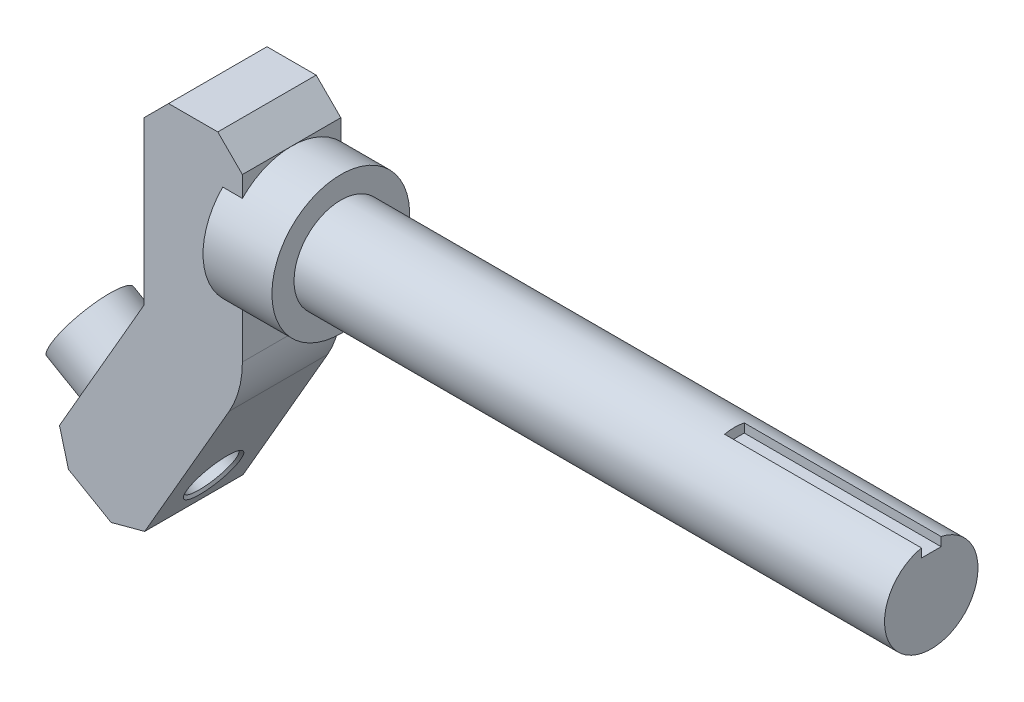
ISO-10303-21;
HEADER;
FILE_DESCRIPTION(('STEP AP214'),'2;1');
FILE_NAME('part.step','',(''),(''),'','','');
FILE_SCHEMA(('AUTOMOTIVE_DESIGN { 1 0 10303 214 1 1 1 1 }'));
ENDSEC;
DATA;
#1=APPLICATION_CONTEXT('core data for automotive mechanical design processes');
#2=APPLICATION_PROTOCOL_DEFINITION('international standard','automotive_design',2000,#1);
#3=PRODUCT_CONTEXT('',#1,'mechanical');
#4=PRODUCT('Part','Part','',(#3));
#5=PRODUCT_RELATED_PRODUCT_CATEGORY('part','',(#4));
#6=PRODUCT_DEFINITION_FORMATION('','',#4);
#7=PRODUCT_DEFINITION_CONTEXT('part definition',#1,'design');
#8=PRODUCT_DEFINITION('design','',#6,#7);
#9=PRODUCT_DEFINITION_SHAPE('','',#8);
#10=(LENGTH_UNIT() NAMED_UNIT(*) SI_UNIT(.MILLI.,.METRE.));
#11=(NAMED_UNIT(*) PLANE_ANGLE_UNIT() SI_UNIT($,.RADIAN.));
#12=(NAMED_UNIT(*) SI_UNIT($,.STERADIAN.) SOLID_ANGLE_UNIT());
#13=UNCERTAINTY_MEASURE_WITH_UNIT(LENGTH_MEASURE(1.E-05),#10,'distance_accuracy_value','');
#14=(GEOMETRIC_REPRESENTATION_CONTEXT(3) GLOBAL_UNCERTAINTY_ASSIGNED_CONTEXT((#13)) GLOBAL_UNIT_ASSIGNED_CONTEXT((#10,
#11,#12)) REPRESENTATION_CONTEXT('',''));
#15=CARTESIAN_POINT('',(0.,0.,0.));
#16=DIRECTION('',(0.,0.,1.));
#17=DIRECTION('',(1.,0.,0.));
#18=AXIS2_PLACEMENT_3D('',#15,#16,#17);
#19=CARTESIAN_POINT('',(-30.,-19.,10.));
#20=DIRECTION('',(0.866025403784438,-0.500000000000001,0.));
#21=DIRECTION('',(0.500000000000001,0.866025403784438,0.));
#22=AXIS2_PLACEMENT_3D('',#19,#20,#21);
#23=PLANE('',#22);
#24=DIRECTION('',(0.,0.,1.));
#25=VECTOR('',#24,1.);
#26=CARTESIAN_POINT('',(-47.1727586640479,-48.7440905122495,10.));
#27=LINE('',#26,#25);
#28=CARTESIAN_POINT('',(-47.1727586640479,-48.7440905122495,-10.));
#29=VERTEX_POINT('',#28);
#30=CARTESIAN_POINT('',(-47.1727586640479,-48.7440905122495,0.));
#31=VERTEX_POINT('',#30);
#32=EDGE_CURVE('E206',#29,#31,#27,.T.);
#33=ORIENTED_EDGE('',*,*,#32,.T.);
#34=CARTESIAN_POINT('',(-43.1727586640478,-41.815887281974,0.));
#35=DIRECTION('',(-0.866025403784438,0.500000000000001,0.));
#36=DIRECTION('',(-0.500000000000001,-0.866025403784438,0.));
#37=AXIS2_PLACEMENT_3D('',#34,#35,#36);
#38=CIRCLE('',#37,8.);
#39=EDGE_CURVE('E208',#31,#31,#38,.T.);
#40=ORIENTED_EDGE('',*,*,#39,.F.);
#41=CARTESIAN_POINT('',(-47.1727586640479,-48.7440905122495,10.));
#42=VERTEX_POINT('',#41);
#43=EDGE_CURVE('E66',#31,#42,#27,.T.);
#44=ORIENTED_EDGE('',*,*,#43,.T.);
#45=DIRECTION('',(-0.500000000000001,-0.866025403784438,0.));
#46=VECTOR('',#45,1.);
#47=CARTESIAN_POINT('',(-30.,-19.,10.));
#48=LINE('',#47,#46);
#49=CARTESIAN_POINT('',(-30.,-19.,10.));
#50=VERTEX_POINT('',#49);
#51=EDGE_CURVE('E607',#50,#42,#48,.T.);
#52=ORIENTED_EDGE('',*,*,#51,.F.);
#53=DIRECTION('',(0.,0.,-1.));
#54=VECTOR('',#53,1.);
#55=CARTESIAN_POINT('',(-30.,-19.,10.));
#56=LINE('',#55,#54);
#57=CARTESIAN_POINT('',(-30.,-19.,-10.));
#58=VERTEX_POINT('',#57);
#59=EDGE_CURVE('E554',#50,#58,#56,.T.);
#60=ORIENTED_EDGE('',*,*,#59,.T.);
#61=DIRECTION('',(-0.500000000000001,-0.866025403784438,0.));
#62=VECTOR('',#61,1.);
#63=CARTESIAN_POINT('',(-30.,-19.,-10.));
#64=LINE('',#63,#62);
#65=EDGE_CURVE('E211',#58,#29,#64,.T.);
#66=ORIENTED_EDGE('',*,*,#65,.T.);
#67=EDGE_LOOP('',(#33,#40,#44,#52,#60,#66));
#68=FACE_BOUND('',#67,.T.);
#69=ADVANCED_FACE('F41',(#68),#23,.F.);
#70=CARTESIAN_POINT('',(-10.,19.,10.));
#71=DIRECTION('',(-1.,0.,0.));
#72=DIRECTION('',(0.,-1.,0.));
#73=AXIS2_PLACEMENT_3D('',#70,#71,#72);
#74=PLANE('',#73);
#75=DIRECTION('',(0.,1.,0.));
#76=VECTOR('',#75,1.);
#77=CARTESIAN_POINT('',(-10.,19.,-10.));
#78=LINE('',#77,#76);
#79=CARTESIAN_POINT('',(-9.99999999999999,9.79795897113271,-10.));
#80=VERTEX_POINT('',#79);
#81=CARTESIAN_POINT('',(-10.,14.,-10.));
#82=VERTEX_POINT('',#81);
#83=EDGE_CURVE('E591',#80,#82,#78,.T.);
#84=ORIENTED_EDGE('',*,*,#83,.T.);
#85=DIRECTION('',(0.,0.,1.));
#86=VECTOR('',#85,1.);
#87=CARTESIAN_POINT('',(-10.,14.,10.));
#88=LINE('',#87,#86);
#89=CARTESIAN_POINT('',(-10.,14.,0.));
#90=VERTEX_POINT('',#89);
#91=EDGE_CURVE('E434',#82,#90,#88,.T.);
#92=ORIENTED_EDGE('',*,*,#91,.T.);
#93=CARTESIAN_POINT('',(-9.99999999999999,0.,0.));
#94=DIRECTION('',(-1.,0.,0.));
#95=DIRECTION('',(0.,-1.,0.));
#96=AXIS2_PLACEMENT_3D('',#93,#94,#95);
#97=CIRCLE('',#96,14.);
#98=EDGE_CURVE('E467',#90,#80,#97,.T.);
#99=ORIENTED_EDGE('',*,*,#98,.T.);
#100=EDGE_LOOP('',(#84,#92,#99));
#101=FACE_BOUND('',#100,.T.);
#102=ADVANCED_FACE('F259',(#101),#74,.F.);
#103=CARTESIAN_POINT('',(-14.,0.,0.));
#104=DIRECTION('',(1.,0.,0.));
#105=DIRECTION('',(0.,0.,-1.));
#106=AXIS2_PLACEMENT_3D('',#103,#104,#105);
#107=CYLINDRICAL_SURFACE('',#106,14.);
#108=CARTESIAN_POINT('',(0.,0.,0.));
#109=DIRECTION('',(-1.,0.,0.));
#110=DIRECTION('',(0.,0.,1.));
#111=AXIS2_PLACEMENT_3D('',#108,#109,#110);
#112=CIRCLE('',#111,14.);
#113=CARTESIAN_POINT('',(0.,0.,14.));
#114=VERTEX_POINT('',#113);
#115=EDGE_CURVE('E530',#114,#114,#112,.T.);
#116=ORIENTED_EDGE('',*,*,#115,.T.);
#117=EDGE_LOOP('',(#116));
#118=FACE_BOUND('',#117,.T.);
#119=DIRECTION('',(1.,0.,0.));
#120=VECTOR('',#119,1.);
#121=CARTESIAN_POINT('',(-14.,9.79795897113271,10.));
#122=LINE('',#121,#120);
#123=CARTESIAN_POINT('',(-14.,9.79795897113271,10.));
#124=VERTEX_POINT('',#123);
#125=CARTESIAN_POINT('',(-10.,9.79795897113271,10.));
#126=VERTEX_POINT('',#125);
#127=EDGE_CURVE('E535',#124,#126,#122,.T.);
#128=ORIENTED_EDGE('',*,*,#127,.F.);
#129=CARTESIAN_POINT('',(-14.,0.,0.));
#130=DIRECTION('',(-1.,0.,0.));
#131=DIRECTION('',(0.,0.,1.));
#132=AXIS2_PLACEMENT_3D('',#129,#130,#131);
#133=CIRCLE('',#132,14.);
#134=CARTESIAN_POINT('',(-14.,-9.79795897113271,10.));
#135=VERTEX_POINT('',#134);
#136=EDGE_CURVE('E534',#135,#124,#133,.T.);
#137=ORIENTED_EDGE('',*,*,#136,.F.);
#138=DIRECTION('',(1.,0.,0.));
#139=VECTOR('',#138,1.);
#140=CARTESIAN_POINT('',(-14.,-9.79795897113271,10.));
#141=LINE('',#140,#139);
#142=CARTESIAN_POINT('',(-9.99999999999999,-9.79795897113271,10.));
#143=VERTEX_POINT('',#142);
#144=EDGE_CURVE('E542',#143,#135,#141,.F.);
#145=ORIENTED_EDGE('',*,*,#144,.F.);
#146=CARTESIAN_POINT('',(-10.,0.,0.));
#147=DIRECTION('',(-1.,0.,0.));
#148=DIRECTION('',(0.,-1.,0.));
#149=AXIS2_PLACEMENT_3D('',#146,#147,#148);
#150=CIRCLE('',#149,14.);
#151=CARTESIAN_POINT('',(-9.99999999999999,-9.79795897113271,-10.));
#152=VERTEX_POINT('',#151);
#153=EDGE_CURVE('E468',#152,#143,#150,.T.);
#154=ORIENTED_EDGE('',*,*,#153,.F.);
#155=DIRECTION('',(1.,0.,0.));
#156=VECTOR('',#155,1.);
#157=CARTESIAN_POINT('',(-14.,-9.79795897113271,-10.));
#158=LINE('',#157,#156);
#159=CARTESIAN_POINT('',(-14.,-9.79795897113271,-10.));
#160=VERTEX_POINT('',#159);
#161=EDGE_CURVE('E550',#152,#160,#158,.F.);
#162=ORIENTED_EDGE('',*,*,#161,.T.);
#163=CARTESIAN_POINT('',(-14.,9.79795897113271,-10.));
#164=VERTEX_POINT('',#163);
#165=EDGE_CURVE('E487',#164,#160,#133,.T.);
#166=ORIENTED_EDGE('',*,*,#165,.F.);
#167=DIRECTION('',(1.,0.,0.));
#168=VECTOR('',#167,1.);
#169=CARTESIAN_POINT('',(-14.,9.79795897113271,-10.));
#170=LINE('',#169,#168);
#171=EDGE_CURVE('E546',#164,#80,#170,.T.);
#172=ORIENTED_EDGE('',*,*,#171,.T.);
#173=ORIENTED_EDGE('',*,*,#98,.F.);
#174=EDGE_CURVE('E463',#126,#90,#97,.T.);
#175=ORIENTED_EDGE('',*,*,#174,.F.);
#176=EDGE_LOOP('',(#128,#137,#145,#154,#162,#166,#172,#173,#175));
#177=FACE_BOUND('',#176,.T.);
#178=ADVANCED_FACE('F264',(#118,#177),#107,.T.);
#179=CARTESIAN_POINT('',(-14.,0.,0.));
#180=DIRECTION('',(-1.,0.,0.));
#181=DIRECTION('',(0.,0.,1.));
#182=AXIS2_PLACEMENT_3D('',#179,#180,#181);
#183=PLANE('',#182);
#184=DIRECTION('',(0.,-1.,0.));
#185=VECTOR('',#184,1.);
#186=CARTESIAN_POINT('',(-14.,0.,-10.));
#187=LINE('',#186,#185);
#188=CARTESIAN_POINT('',(-14.,-8.49999999999997,-10.));
#189=VERTEX_POINT('',#188);
#190=EDGE_CURVE('E477',#189,#160,#187,.T.);
#191=ORIENTED_EDGE('',*,*,#190,.F.);
#192=DIRECTION('',(0.,0.,-1.));
#193=VECTOR('',#192,1.);
#194=CARTESIAN_POINT('',(-14.,-8.49999999999997,0.));
#195=LINE('',#194,#193);
#196=CARTESIAN_POINT('',(-14.,-8.49999999999997,10.));
#197=VERTEX_POINT('',#196);
#198=EDGE_CURVE('E418',#189,#197,#195,.F.);
#199=ORIENTED_EDGE('',*,*,#198,.T.);
#200=DIRECTION('',(0.,-1.,0.));
#201=VECTOR('',#200,1.);
#202=CARTESIAN_POINT('',(-14.,0.,10.));
#203=LINE('',#202,#201);
#204=EDGE_CURVE('E473',#197,#135,#203,.T.);
#205=ORIENTED_EDGE('',*,*,#204,.T.);
#206=ORIENTED_EDGE('',*,*,#136,.T.);
#207=CARTESIAN_POINT('',(-14.,8.49999999999998,10.));
#208=VERTEX_POINT('',#207);
#209=EDGE_CURVE('E472',#124,#208,#203,.T.);
#210=ORIENTED_EDGE('',*,*,#209,.T.);
#211=DIRECTION('',(0.,0.,1.));
#212=VECTOR('',#211,1.);
#213=CARTESIAN_POINT('',(-14.,8.49999999999998,0.));
#214=LINE('',#213,#212);
#215=CARTESIAN_POINT('',(-14.,8.49999999999998,-10.));
#216=VERTEX_POINT('',#215);
#217=EDGE_CURVE('E422',#208,#216,#214,.F.);
#218=ORIENTED_EDGE('',*,*,#217,.T.);
#219=EDGE_CURVE('E476',#164,#216,#187,.T.);
#220=ORIENTED_EDGE('',*,*,#219,.F.);
#221=ORIENTED_EDGE('',*,*,#165,.T.);
#222=EDGE_LOOP('',(#191,#199,#205,#206,#210,#218,#220,#221));
#223=FACE_BOUND('',#222,.T.);
#224=ADVANCED_FACE('F283',(#223),#183,.T.);
#225=CARTESIAN_POINT('',(120.,0.,0.));
#226=DIRECTION('',(-1.,0.,0.));
#227=DIRECTION('',(0.,0.,1.));
#228=AXIS2_PLACEMENT_3D('',#225,#226,#227);
#229=CYLINDRICAL_SURFACE('',#228,9.5);
#230=CARTESIAN_POINT('',(80.,0.,0.));
#231=DIRECTION('',(1.,0.,0.));
#232=DIRECTION('',(0.,0.,-1.));
#233=AXIS2_PLACEMENT_3D('',#230,#231,#232);
#234=CIRCLE('',#233,9.5);
#235=CARTESIAN_POINT('',(80.,9.28708781050335,-2.));
#236=VERTEX_POINT('',#235);
#237=CARTESIAN_POINT('',(80.,9.28708781050335,2.));
#238=VERTEX_POINT('',#237);
#239=EDGE_CURVE('E508',#236,#238,#234,.T.);
#240=ORIENTED_EDGE('',*,*,#239,.F.);
#241=DIRECTION('',(1.,0.,0.));
#242=VECTOR('',#241,1.);
#243=CARTESIAN_POINT('',(80.,9.28708781050335,-2.));
#244=LINE('',#243,#242);
#245=CARTESIAN_POINT('',(120.,9.28708781050335,-2.));
#246=VERTEX_POINT('',#245);
#247=EDGE_CURVE('E491',#236,#246,#244,.T.);
#248=ORIENTED_EDGE('',*,*,#247,.T.);
#249=CARTESIAN_POINT('',(120.,0.,0.));
#250=DIRECTION('',(1.,0.,0.));
#251=DIRECTION('',(0.,0.,-1.));
#252=AXIS2_PLACEMENT_3D('',#249,#250,#251);
#253=CIRCLE('',#252,9.5);
#254=CARTESIAN_POINT('',(120.,9.28708781050335,2.));
#255=VERTEX_POINT('',#254);
#256=EDGE_CURVE('E481',#255,#246,#253,.T.);
#257=ORIENTED_EDGE('',*,*,#256,.F.);
#258=DIRECTION('',(1.,0.,0.));
#259=VECTOR('',#258,1.);
#260=CARTESIAN_POINT('',(80.,9.28708781050335,2.));
#261=LINE('',#260,#259);
#262=EDGE_CURVE('E492',#238,#255,#261,.T.);
#263=ORIENTED_EDGE('',*,*,#262,.F.);
#264=EDGE_LOOP('',(#240,#248,#257,#263));
#265=FACE_BOUND('',#264,.T.);
#266=CARTESIAN_POINT('',(0.,0.,0.));
#267=DIRECTION('',(1.,0.,0.));
#268=DIRECTION('',(0.,0.,-1.));
#269=AXIS2_PLACEMENT_3D('',#266,#267,#268);
#270=CIRCLE('',#269,9.5);
#271=CARTESIAN_POINT('',(0.,0.,-9.5));
#272=VERTEX_POINT('',#271);
#273=EDGE_CURVE('E482',#272,#272,#270,.T.);
#274=ORIENTED_EDGE('',*,*,#273,.T.);
#275=EDGE_LOOP('',(#274));
#276=FACE_BOUND('',#275,.T.);
#277=ADVANCED_FACE('F286',(#265,#276),#229,.T.);
#278=CARTESIAN_POINT('',(120.,0.,0.));
#279=DIRECTION('',(1.,0.,0.));
#280=DIRECTION('',(0.,0.,-1.));
#281=AXIS2_PLACEMENT_3D('',#278,#279,#280);
#282=PLANE('',#281);
#283=DIRECTION('',(0.,1.,0.));
#284=VECTOR('',#283,1.);
#285=CARTESIAN_POINT('',(120.,7.5,-2.));
#286=LINE('',#285,#284);
#287=CARTESIAN_POINT('',(120.,7.5,-2.));
#288=VERTEX_POINT('',#287);
#289=EDGE_CURVE('E505',#288,#246,#286,.T.);
#290=ORIENTED_EDGE('',*,*,#289,.F.);
#291=DIRECTION('',(0.,0.,-1.));
#292=VECTOR('',#291,1.);
#293=CARTESIAN_POINT('',(120.,7.5,2.));
#294=LINE('',#293,#292);
#295=CARTESIAN_POINT('',(120.,7.5,2.));
#296=VERTEX_POINT('',#295);
#297=EDGE_CURVE('E509',#296,#288,#294,.T.);
#298=ORIENTED_EDGE('',*,*,#297,.F.);
#299=DIRECTION('',(0.,-1.,0.));
#300=VECTOR('',#299,1.);
#301=CARTESIAN_POINT('',(120.,9.28708781050335,2.));
#302=LINE('',#301,#300);
#303=EDGE_CURVE('E486',#255,#296,#302,.T.);
#304=ORIENTED_EDGE('',*,*,#303,.F.);
#305=ORIENTED_EDGE('',*,*,#256,.T.);
#306=EDGE_LOOP('',(#290,#298,#304,#305));
#307=FACE_BOUND('',#306,.T.);
#308=ADVANCED_FACE('F305',(#307),#282,.T.);
#309=CARTESIAN_POINT('',(80.,7.5,-2.));
#310=DIRECTION('',(0.,0.,-1.));
#311=DIRECTION('',(-1.,0.,0.));
#312=AXIS2_PLACEMENT_3D('',#309,#310,#311);
#313=PLANE('',#312);
#314=ORIENTED_EDGE('',*,*,#289,.T.);
#315=ORIENTED_EDGE('',*,*,#247,.F.);
#316=DIRECTION('',(0.,1.,0.));
#317=VECTOR('',#316,1.);
#318=CARTESIAN_POINT('',(80.,7.5,-2.));
#319=LINE('',#318,#317);
#320=CARTESIAN_POINT('',(80.,7.5,-2.));
#321=VERTEX_POINT('',#320);
#322=EDGE_CURVE('E496',#321,#236,#319,.T.);
#323=ORIENTED_EDGE('',*,*,#322,.F.);
#324=DIRECTION('',(1.,0.,0.));
#325=VECTOR('',#324,1.);
#326=CARTESIAN_POINT('',(80.,7.5,-2.));
#327=LINE('',#326,#325);
#328=EDGE_CURVE('E499',#321,#288,#327,.T.);
#329=ORIENTED_EDGE('',*,*,#328,.T.);
#330=EDGE_LOOP('',(#314,#315,#323,#329));
#331=FACE_BOUND('',#330,.T.);
#332=ADVANCED_FACE('F301',(#331),#313,.F.);
#333=CARTESIAN_POINT('',(80.,7.5,2.));
#334=DIRECTION('',(0.,-1.,0.));
#335=DIRECTION('',(0.,0.,-1.));
#336=AXIS2_PLACEMENT_3D('',#333,#334,#335);
#337=PLANE('',#336);
#338=ORIENTED_EDGE('',*,*,#297,.T.);
#339=ORIENTED_EDGE('',*,*,#328,.F.);
#340=DIRECTION('',(0.,0.,-1.));
#341=VECTOR('',#340,1.);
#342=CARTESIAN_POINT('',(80.,7.5,2.));
#343=LINE('',#342,#341);
#344=CARTESIAN_POINT('',(80.,7.5,2.));
#345=VERTEX_POINT('',#344);
#346=EDGE_CURVE('E519',#345,#321,#343,.T.);
#347=ORIENTED_EDGE('',*,*,#346,.F.);
#348=DIRECTION('',(1.,0.,0.));
#349=VECTOR('',#348,1.);
#350=CARTESIAN_POINT('',(80.,7.5,2.));
#351=LINE('',#350,#349);
#352=EDGE_CURVE('E495',#345,#296,#351,.T.);
#353=ORIENTED_EDGE('',*,*,#352,.T.);
#354=EDGE_LOOP('',(#338,#339,#347,#353));
#355=FACE_BOUND('',#354,.T.);
#356=ADVANCED_FACE('F304',(#355),#337,.F.);
#357=CARTESIAN_POINT('',(80.,9.28708781050335,2.));
#358=DIRECTION('',(0.,0.,1.));
#359=DIRECTION('',(1.,0.,0.));
#360=AXIS2_PLACEMENT_3D('',#357,#358,#359);
#361=PLANE('',#360);
#362=ORIENTED_EDGE('',*,*,#303,.T.);
#363=ORIENTED_EDGE('',*,*,#352,.F.);
#364=DIRECTION('',(0.,-1.,0.));
#365=VECTOR('',#364,1.);
#366=CARTESIAN_POINT('',(80.,9.28708781050335,2.));
#367=LINE('',#366,#365);
#368=EDGE_CURVE('E523',#238,#345,#367,.T.);
#369=ORIENTED_EDGE('',*,*,#368,.F.);
#370=ORIENTED_EDGE('',*,*,#262,.T.);
#371=EDGE_LOOP('',(#362,#363,#369,#370));
#372=FACE_BOUND('',#371,.T.);
#373=ADVANCED_FACE('F299',(#372),#361,.F.);
#374=CARTESIAN_POINT('',(80.,0.,0.));
#375=DIRECTION('',(1.,0.,0.));
#376=DIRECTION('',(0.,0.,-1.));
#377=AXIS2_PLACEMENT_3D('',#374,#375,#376);
#378=PLANE('',#377);
#379=ORIENTED_EDGE('',*,*,#239,.T.);
#380=ORIENTED_EDGE('',*,*,#368,.T.);
#381=ORIENTED_EDGE('',*,*,#346,.T.);
#382=ORIENTED_EDGE('',*,*,#322,.T.);
#383=EDGE_LOOP('',(#379,#380,#381,#382));
#384=FACE_BOUND('',#383,.T.);
#385=ADVANCED_FACE('F292',(#384),#378,.T.);
#386=CARTESIAN_POINT('',(0.,0.,0.));
#387=DIRECTION('',(-1.,0.,0.));
#388=DIRECTION('',(0.,0.,1.));
#389=AXIS2_PLACEMENT_3D('',#386,#387,#388);
#390=PLANE('',#389);
#391=ORIENTED_EDGE('',*,*,#273,.F.);
#392=EDGE_LOOP('',(#391));
#393=FACE_BOUND('',#392,.T.);
#394=ORIENTED_EDGE('',*,*,#115,.F.);
#395=EDGE_LOOP('',(#394));
#396=FACE_BOUND('',#395,.T.);
#397=ADVANCED_FACE('F288',(#393,#396),#390,.F.);
#398=CARTESIAN_POINT('',(-30.,-19.,10.));
#399=DIRECTION('',(0.,0.,-1.));
#400=DIRECTION('',(-1.,0.,0.));
#401=AXIS2_PLACEMENT_3D('',#398,#399,#400);
#402=PLANE('',#401);
#403=ORIENTED_EDGE('',*,*,#51,.T.);
#404=DIRECTION('',(-0.258819045102519,0.965925826289069,0.));
#405=VECTOR('',#404,1.);
#406=CARTESIAN_POINT('',(-45.3426316451257,-55.5742175311717,10.));
#407=LINE('',#406,#405);
#408=CARTESIAN_POINT('',(-45.3426316451257,-55.5742175311717,10.));
#409=VERTEX_POINT('',#408);
#410=EDGE_CURVE('E218',#42,#409,#407,.F.);
#411=ORIENTED_EDGE('',*,*,#410,.T.);
#412=DIRECTION('',(0.866025403784438,-0.500000000000001,0.));
#413=VECTOR('',#412,1.);
#414=CARTESIAN_POINT('',(-32.3522505883591,-63.0742175311718,10.));
#415=LINE('',#414,#413);
#416=CARTESIAN_POINT('',(-36.6823776072814,-60.5742175311717,10.));
#417=VERTEX_POINT('',#416);
#418=EDGE_CURVE('E389',#409,#417,#415,.T.);
#419=ORIENTED_EDGE('',*,*,#418,.T.);
#420=DIRECTION('',(-0.965925826289069,-0.258819045102518,0.));
#421=VECTOR('',#420,1.);
#422=CARTESIAN_POINT('',(-29.8522505883591,-58.7440905122496,10.));
#423=LINE('',#422,#421);
#424=CARTESIAN_POINT('',(-29.8522505883591,-58.7440905122496,10.));
#425=VERTEX_POINT('',#424);
#426=EDGE_CURVE('E58',#417,#425,#423,.F.);
#427=ORIENTED_EDGE('',*,*,#426,.T.);
#428=DIRECTION('',(0.500000000000001,0.866025403784438,0.));
#429=VECTOR('',#428,1.);
#430=CARTESIAN_POINT('',(-12.6794919243112,-29.,10.));
#431=LINE('',#430,#429);
#432=CARTESIAN_POINT('',(-12.6794919243112,-29.,10.));
#433=VERTEX_POINT('',#432);
#434=EDGE_CURVE('E381',#425,#433,#431,.T.);
#435=ORIENTED_EDGE('',*,*,#434,.T.);
#436=CARTESIAN_POINT('',(-30.,-19.,10.));
#437=DIRECTION('',(0.,0.,1.));
#438=DIRECTION('',(-1.,0.,0.));
#439=AXIS2_PLACEMENT_3D('',#436,#437,#438);
#440=CIRCLE('',#439,20.);
#441=CARTESIAN_POINT('',(-10.,-19.,10.));
#442=VERTEX_POINT('',#441);
#443=EDGE_CURVE('E388',#433,#442,#440,.T.);
#444=ORIENTED_EDGE('',*,*,#443,.T.);
#445=DIRECTION('',(0.,1.,0.));
#446=VECTOR('',#445,1.);
#447=CARTESIAN_POINT('',(-9.99999999999999,-9.5,10.));
#448=LINE('',#447,#446);
#449=EDGE_CURVE('E599',#442,#143,#448,.T.);
#450=ORIENTED_EDGE('',*,*,#449,.T.);
#451=ORIENTED_EDGE('',*,*,#144,.T.);
#452=ORIENTED_EDGE('',*,*,#204,.F.);
#453=DIRECTION('',(0.707106781186544,-0.707106781186551,0.));
#454=VECTOR('',#453,1.);
#455=CARTESIAN_POINT('',(-16.7499999999999,-5.75000000000004,10.));
#456=LINE('',#455,#454);
#457=CARTESIAN_POINT('',(-15.,-7.49999999999997,10.));
#458=VERTEX_POINT('',#457);
#459=EDGE_CURVE('E411',#197,#458,#456,.F.);
#460=ORIENTED_EDGE('',*,*,#459,.T.);
#461=DIRECTION('',(0.,1.,0.));
#462=VECTOR('',#461,1.);
#463=CARTESIAN_POINT('',(-15.,9.5,10.));
#464=LINE('',#463,#462);
#465=CARTESIAN_POINT('',(-15.,7.49999999999999,10.));
#466=VERTEX_POINT('',#465);
#467=EDGE_CURVE('E563',#458,#466,#464,.T.);
#468=ORIENTED_EDGE('',*,*,#467,.T.);
#469=DIRECTION('',(-0.707106781186551,-0.707106781186544,0.));
#470=VECTOR('',#469,1.);
#471=CARTESIAN_POINT('',(-35.7500000000001,-13.2499999999999,10.));
#472=LINE('',#471,#470);
#473=EDGE_CURVE('E404',#466,#208,#472,.F.);
#474=ORIENTED_EDGE('',*,*,#473,.T.);
#475=ORIENTED_EDGE('',*,*,#209,.F.);
#476=ORIENTED_EDGE('',*,*,#127,.T.);
#477=DIRECTION('',(0.,1.,0.));
#478=VECTOR('',#477,1.);
#479=CARTESIAN_POINT('',(-10.,19.,10.));
#480=LINE('',#479,#478);
#481=CARTESIAN_POINT('',(-10.,14.,10.));
#482=VERTEX_POINT('',#481);
#483=EDGE_CURVE('E568',#126,#482,#480,.T.);
#484=ORIENTED_EDGE('',*,*,#483,.T.);
#485=DIRECTION('',(0.707106781186544,-0.707106781186551,0.));
#486=VECTOR('',#485,1.);
#487=CARTESIAN_POINT('',(-14.9999999999999,19.,10.));
#488=LINE('',#487,#486);
#489=CARTESIAN_POINT('',(-14.9999999999999,19.,10.));
#490=VERTEX_POINT('',#489);
#491=EDGE_CURVE('E443',#482,#490,#488,.F.);
#492=ORIENTED_EDGE('',*,*,#491,.T.);
#493=DIRECTION('',(-1.,0.,0.));
#494=VECTOR('',#493,1.);
#495=CARTESIAN_POINT('',(-10.,19.,10.));
#496=LINE('',#495,#494);
#497=CARTESIAN_POINT('',(-25.,19.,10.));
#498=VERTEX_POINT('',#497);
#499=EDGE_CURVE('E613',#490,#498,#496,.T.);
#500=ORIENTED_EDGE('',*,*,#499,.T.);
#501=DIRECTION('',(0.707106781186549,0.707106781186546,0.));
#502=VECTOR('',#501,1.);
#503=CARTESIAN_POINT('',(-30.,14.,10.));
#504=LINE('',#503,#502);
#505=CARTESIAN_POINT('',(-30.,14.,10.));
#506=VERTEX_POINT('',#505);
#507=EDGE_CURVE('E440',#498,#506,#504,.F.);
#508=ORIENTED_EDGE('',*,*,#507,.T.);
#509=DIRECTION('',(0.,-1.,0.));
#510=VECTOR('',#509,1.);
#511=CARTESIAN_POINT('',(-30.,19.,10.));
#512=LINE('',#511,#510);
#513=EDGE_CURVE('E610',#506,#50,#512,.T.);
#514=ORIENTED_EDGE('',*,*,#513,.T.);
#515=EDGE_LOOP('',(#403,#411,#419,#427,#435,#444,#450,#451,#452,#460,#468,#474,#475,#476,#484,
#492,#500,#508,#514));
#516=FACE_BOUND('',#515,.T.);
#517=ADVANCED_FACE('F291',(#516),#402,.F.);
#518=CARTESIAN_POINT('',(-30.,-19.,-10.));
#519=DIRECTION('',(0.,0.,-1.));
#520=DIRECTION('',(-1.,0.,0.));
#521=AXIS2_PLACEMENT_3D('',#518,#519,#520);
#522=PLANE('',#521);
#523=DIRECTION('',(0.866025403784438,-0.500000000000001,0.));
#524=VECTOR('',#523,1.);
#525=CARTESIAN_POINT('',(-32.3522505883591,-63.0742175311718,-10.));
#526=LINE('',#525,#524);
#527=CARTESIAN_POINT('',(-45.3426316451257,-55.5742175311717,-10.));
#528=VERTEX_POINT('',#527);
#529=CARTESIAN_POINT('',(-36.6823776072814,-60.5742175311717,-10.));
#530=VERTEX_POINT('',#529);
#531=EDGE_CURVE('E579',#528,#530,#526,.T.);
#532=ORIENTED_EDGE('',*,*,#531,.F.);
#533=DIRECTION('',(0.258819045102519,-0.965925826289069,0.));
#534=VECTOR('',#533,1.);
#535=CARTESIAN_POINT('',(-53.4584245881487,-25.2856659241008,-10.));
#536=LINE('',#535,#534);
#537=EDGE_CURVE('E220',#528,#29,#536,.F.);
#538=ORIENTED_EDGE('',*,*,#537,.T.);
#539=ORIENTED_EDGE('',*,*,#65,.F.);
#540=DIRECTION('',(0.,-1.,0.));
#541=VECTOR('',#540,1.);
#542=CARTESIAN_POINT('',(-30.,19.,-10.));
#543=LINE('',#542,#541);
#544=CARTESIAN_POINT('',(-30.,14.,-10.));
#545=VERTEX_POINT('',#544);
#546=EDGE_CURVE('E584',#545,#58,#543,.T.);
#547=ORIENTED_EDGE('',*,*,#546,.F.);
#548=DIRECTION('',(-0.707106781186549,-0.707106781186546,0.));
#549=VECTOR('',#548,1.);
#550=CARTESIAN_POINT('',(-46.5,-2.49999999999989,-10.));
#551=LINE('',#550,#549);
#552=CARTESIAN_POINT('',(-25.,19.,-10.));
#553=VERTEX_POINT('',#552);
#554=EDGE_CURVE('E453',#545,#553,#551,.F.);
#555=ORIENTED_EDGE('',*,*,#554,.T.);
#556=DIRECTION('',(-1.,0.,0.));
#557=VECTOR('',#556,1.);
#558=CARTESIAN_POINT('',(-10.,19.,-10.));
#559=LINE('',#558,#557);
#560=CARTESIAN_POINT('',(-14.9999999999999,19.,-10.));
#561=VERTEX_POINT('',#560);
#562=EDGE_CURVE('E587',#561,#553,#559,.T.);
#563=ORIENTED_EDGE('',*,*,#562,.F.);
#564=DIRECTION('',(-0.707106781186544,0.707106781186551,0.));
#565=VECTOR('',#564,1.);
#566=CARTESIAN_POINT('',(-3.49999999999989,7.49999999999981,-10.));
#567=LINE('',#566,#565);
#568=EDGE_CURVE('E456',#561,#82,#567,.F.);
#569=ORIENTED_EDGE('',*,*,#568,.T.);
#570=ORIENTED_EDGE('',*,*,#83,.F.);
#571=ORIENTED_EDGE('',*,*,#171,.F.);
#572=ORIENTED_EDGE('',*,*,#219,.T.);
#573=DIRECTION('',(0.707106781186551,0.707106781186544,0.));
#574=VECTOR('',#573,1.);
#575=CARTESIAN_POINT('',(-13.,9.5,-10.));
#576=LINE('',#575,#574);
#577=CARTESIAN_POINT('',(-15.,7.49999999999999,-10.));
#578=VERTEX_POINT('',#577);
#579=EDGE_CURVE('E408',#216,#578,#576,.F.);
#580=ORIENTED_EDGE('',*,*,#579,.T.);
#581=DIRECTION('',(0.,1.,0.));
#582=VECTOR('',#581,1.);
#583=CARTESIAN_POINT('',(-15.,9.5,-10.));
#584=LINE('',#583,#582);
#585=CARTESIAN_POINT('',(-15.,-7.49999999999997,-10.));
#586=VERTEX_POINT('',#585);
#587=EDGE_CURVE('E564',#586,#578,#584,.T.);
#588=ORIENTED_EDGE('',*,*,#587,.F.);
#589=DIRECTION('',(-0.707106781186544,0.707106781186551,0.));
#590=VECTOR('',#589,1.);
#591=CARTESIAN_POINT('',(-15.,-7.49999999999997,-10.));
#592=LINE('',#591,#590);
#593=EDGE_CURVE('E414',#586,#189,#592,.F.);
#594=ORIENTED_EDGE('',*,*,#593,.T.);
#595=ORIENTED_EDGE('',*,*,#190,.T.);
#596=ORIENTED_EDGE('',*,*,#161,.F.);
#597=DIRECTION('',(0.,1.,0.));
#598=VECTOR('',#597,1.);
#599=CARTESIAN_POINT('',(-9.99999999999999,-9.5,-10.));
#600=LINE('',#599,#598);
#601=CARTESIAN_POINT('',(-10.,-19.,-10.));
#602=VERTEX_POINT('',#601);
#603=EDGE_CURVE('E569',#602,#152,#600,.T.);
#604=ORIENTED_EDGE('',*,*,#603,.F.);
#605=CARTESIAN_POINT('',(-30.,-19.,-10.));
#606=DIRECTION('',(0.,0.,1.));
#607=DIRECTION('',(-1.,0.,0.));
#608=AXIS2_PLACEMENT_3D('',#605,#606,#607);
#609=CIRCLE('',#608,20.);
#610=CARTESIAN_POINT('',(-12.6794919243112,-29.,-10.));
#611=VERTEX_POINT('',#610);
#612=EDGE_CURVE('E573',#611,#602,#609,.T.);
#613=ORIENTED_EDGE('',*,*,#612,.F.);
#614=DIRECTION('',(0.500000000000001,0.866025403784438,0.));
#615=VECTOR('',#614,1.);
#616=CARTESIAN_POINT('',(-12.6794919243112,-29.,-10.));
#617=LINE('',#616,#615);
#618=CARTESIAN_POINT('',(-29.8522505883591,-58.7440905122496,-10.));
#619=VERTEX_POINT('',#618);
#620=EDGE_CURVE('E576',#619,#611,#617,.T.);
#621=ORIENTED_EDGE('',*,*,#620,.F.);
#622=DIRECTION('',(0.965925826289069,0.258819045102518,0.));
#623=VECTOR('',#622,1.);
#624=CARTESIAN_POINT('',(-20.0540800380549,-56.1186786259932,-10.));
#625=LINE('',#624,#623);
#626=EDGE_CURVE('E222',#619,#530,#625,.F.);
#627=ORIENTED_EDGE('',*,*,#626,.T.);
#628=EDGE_LOOP('',(#532,#538,#539,#547,#555,#563,#569,#570,#571,#572,#580,#588,#594,#595,#596,
#604,#613,#621,#627));
#629=FACE_BOUND('',#628,.T.);
#630=ADVANCED_FACE('F281',(#629),#522,.T.);
#631=ORIENTED_EDGE('',*,*,#174,.T.);
#632=DIRECTION('',(0.,0.,1.));
#633=VECTOR('',#632,1.);
#634=CARTESIAN_POINT('',(-10.,14.,10.));
#635=LINE('',#634,#633);
#636=EDGE_CURVE('E437',#90,#482,#635,.T.);
#637=ORIENTED_EDGE('',*,*,#636,.T.);
#638=ORIENTED_EDGE('',*,*,#483,.F.);
#639=EDGE_LOOP('',(#631,#637,#638));
#640=FACE_BOUND('',#639,.T.);
#641=ADVANCED_FACE('F267',(#640),#74,.F.);
#642=CARTESIAN_POINT('',(-10.,19.,10.));
#643=DIRECTION('',(0.,-1.,0.));
#644=DIRECTION('',(1.,0.,0.));
#645=AXIS2_PLACEMENT_3D('',#642,#643,#644);
#646=PLANE('',#645);
#647=ORIENTED_EDGE('',*,*,#562,.T.);
#648=DIRECTION('',(0.,0.,1.));
#649=VECTOR('',#648,1.);
#650=CARTESIAN_POINT('',(-25.,19.,10.));
#651=LINE('',#650,#649);
#652=EDGE_CURVE('E446',#553,#498,#651,.T.);
#653=ORIENTED_EDGE('',*,*,#652,.T.);
#654=ORIENTED_EDGE('',*,*,#499,.F.);
#655=DIRECTION('',(0.,0.,-1.));
#656=VECTOR('',#655,1.);
#657=CARTESIAN_POINT('',(-14.9999999999999,19.,10.));
#658=LINE('',#657,#656);
#659=EDGE_CURVE('E449',#490,#561,#658,.T.);
#660=ORIENTED_EDGE('',*,*,#659,.T.);
#661=EDGE_LOOP('',(#647,#653,#654,#660));
#662=FACE_BOUND('',#661,.T.);
#663=ADVANCED_FACE('F275',(#662),#646,.F.);
#664=CARTESIAN_POINT('',(-30.,19.,10.));
#665=DIRECTION('',(1.,0.,0.));
#666=DIRECTION('',(0.,1.,0.));
#667=AXIS2_PLACEMENT_3D('',#664,#665,#666);
#668=PLANE('',#667);
#669=ORIENTED_EDGE('',*,*,#513,.F.);
#670=DIRECTION('',(0.,0.,-1.));
#671=VECTOR('',#670,1.);
#672=CARTESIAN_POINT('',(-30.,14.,10.));
#673=LINE('',#672,#671);
#674=EDGE_CURVE('E459',#506,#545,#673,.T.);
#675=ORIENTED_EDGE('',*,*,#674,.T.);
#676=ORIENTED_EDGE('',*,*,#546,.T.);
#677=ORIENTED_EDGE('',*,*,#59,.F.);
#678=EDGE_LOOP('',(#669,#675,#676,#677));
#679=FACE_BOUND('',#678,.T.);
#680=ADVANCED_FACE('F272',(#679),#668,.F.);
#681=CARTESIAN_POINT('',(-32.3522505883591,-63.0742175311718,10.));
#682=DIRECTION('',(0.500000000000001,0.866025403784438,0.));
#683=DIRECTION('',(-0.866025403784438,0.500000000000001,0.));
#684=AXIS2_PLACEMENT_3D('',#681,#682,#683);
#685=PLANE('',#684);
#686=ORIENTED_EDGE('',*,*,#418,.F.);
#687=DIRECTION('',(0.,0.,-1.));
#688=VECTOR('',#687,1.);
#689=CARTESIAN_POINT('',(-45.3426316451257,-55.5742175311717,10.));
#690=LINE('',#689,#688);
#691=EDGE_CURVE('E397',#409,#528,#690,.T.);
#692=ORIENTED_EDGE('',*,*,#691,.T.);
#693=ORIENTED_EDGE('',*,*,#531,.T.);
#694=DIRECTION('',(0.,0.,1.));
#695=VECTOR('',#694,1.);
#696=CARTESIAN_POINT('',(-36.6823776072814,-60.5742175311717,10.));
#697=LINE('',#696,#695);
#698=EDGE_CURVE('E392',#530,#417,#697,.T.);
#699=ORIENTED_EDGE('',*,*,#698,.T.);
#700=EDGE_LOOP('',(#686,#692,#693,#699));
#701=FACE_BOUND('',#700,.T.);
#702=ADVANCED_FACE('F270',(#701),#685,.F.);
#703=CARTESIAN_POINT('',(-12.6794919243112,-29.,10.));
#704=DIRECTION('',(-0.866025403784438,0.500000000000001,0.));
#705=DIRECTION('',(-0.500000000000001,-0.866025403784438,0.));
#706=AXIS2_PLACEMENT_3D('',#703,#704,#705);
#707=PLANE('',#706);
#708=CARTESIAN_POINT('',(-25.8522505883591,-51.815887281974,0.));
#709=DIRECTION('',(-0.866025403784438,0.500000000000001,0.));
#710=DIRECTION('',(-0.500000000000001,-0.866025403784438,0.));
#711=AXIS2_PLACEMENT_3D('',#708,#709,#710);
#712=CIRCLE('',#711,5.49999999999998);
#713=CARTESIAN_POINT('',(-28.6022505883591,-56.5790270027884,0.));
#714=VERTEX_POINT('',#713);
#715=EDGE_CURVE('E234',#714,#714,#712,.T.);
#716=ORIENTED_EDGE('',*,*,#715,.T.);
#717=EDGE_LOOP('',(#716));
#718=FACE_BOUND('',#717,.T.);
#719=ORIENTED_EDGE('',*,*,#434,.F.);
#720=DIRECTION('',(0.,0.,-1.));
#721=VECTOR('',#720,1.);
#722=CARTESIAN_POINT('',(-29.8522505883591,-58.7440905122496,10.));
#723=LINE('',#722,#721);
#724=EDGE_CURVE('E230',#425,#619,#723,.T.);
#725=ORIENTED_EDGE('',*,*,#724,.T.);
#726=ORIENTED_EDGE('',*,*,#620,.T.);
#727=DIRECTION('',(0.,0.,-1.));
#728=VECTOR('',#727,1.);
#729=CARTESIAN_POINT('',(-12.6794919243112,-29.,10.));
#730=LINE('',#729,#728);
#731=EDGE_CURVE('E385',#433,#611,#730,.T.);
#732=ORIENTED_EDGE('',*,*,#731,.F.);
#733=EDGE_LOOP('',(#719,#725,#726,#732));
#734=FACE_BOUND('',#733,.T.);
#735=ADVANCED_FACE('F376',(#718,#734),#707,.F.);
#736=CARTESIAN_POINT('',(-30.,-19.,10.));
#737=DIRECTION('',(0.,0.,-1.));
#738=DIRECTION('',(-1.,0.,0.));
#739=AXIS2_PLACEMENT_3D('',#736,#737,#738);
#740=CYLINDRICAL_SURFACE('',#739,20.);
#741=ORIENTED_EDGE('',*,*,#612,.T.);
#742=DIRECTION('',(0.,0.,-1.));
#743=VECTOR('',#742,1.);
#744=CARTESIAN_POINT('',(-10.,-19.,10.));
#745=LINE('',#744,#743);
#746=EDGE_CURVE('E559',#442,#602,#745,.T.);
#747=ORIENTED_EDGE('',*,*,#746,.F.);
#748=ORIENTED_EDGE('',*,*,#443,.F.);
#749=ORIENTED_EDGE('',*,*,#731,.T.);
#750=EDGE_LOOP('',(#741,#747,#748,#749));
#751=FACE_BOUND('',#750,.T.);
#752=ADVANCED_FACE('F379',(#751),#740,.T.);
#753=CARTESIAN_POINT('',(-9.99999999999999,-9.5,10.));
#754=DIRECTION('',(-1.,0.,0.));
#755=DIRECTION('',(0.,-1.,0.));
#756=AXIS2_PLACEMENT_3D('',#753,#754,#755);
#757=PLANE('',#756);
#758=ORIENTED_EDGE('',*,*,#603,.T.);
#759=ORIENTED_EDGE('',*,*,#153,.T.);
#760=ORIENTED_EDGE('',*,*,#449,.F.);
#761=ORIENTED_EDGE('',*,*,#746,.T.);
#762=EDGE_LOOP('',(#758,#759,#760,#761));
#763=FACE_BOUND('',#762,.T.);
#764=ADVANCED_FACE('F667',(#763),#757,.F.);
#765=CARTESIAN_POINT('',(-15.,9.5,10.));
#766=DIRECTION('',(-1.,0.,0.));
#767=DIRECTION('',(0.,-1.,0.));
#768=AXIS2_PLACEMENT_3D('',#765,#766,#767);
#769=PLANE('',#768);
#770=ORIENTED_EDGE('',*,*,#467,.F.);
#771=DIRECTION('',(0.,0.,-1.));
#772=VECTOR('',#771,1.);
#773=CARTESIAN_POINT('',(-15.,-7.49999999999997,-10.));
#774=LINE('',#773,#772);
#775=EDGE_CURVE('E426',#458,#586,#774,.T.);
#776=ORIENTED_EDGE('',*,*,#775,.T.);
#777=ORIENTED_EDGE('',*,*,#587,.T.);
#778=DIRECTION('',(0.,0.,1.));
#779=VECTOR('',#778,1.);
#780=CARTESIAN_POINT('',(-15.,7.49999999999999,10.));
#781=LINE('',#780,#779);
#782=EDGE_CURVE('E430',#578,#466,#781,.T.);
#783=ORIENTED_EDGE('',*,*,#782,.T.);
#784=EDGE_LOOP('',(#770,#776,#777,#783));
#785=FACE_BOUND('',#784,.T.);
#786=ADVANCED_FACE('F327',(#785),#769,.F.);
#787=CARTESIAN_POINT('',(-30.,14.,10.));
#788=DIRECTION('',(0.707106781186546,-0.707106781186549,0.));
#789=DIRECTION('',(0.,0.,-1.));
#790=AXIS2_PLACEMENT_3D('',#787,#788,#789);
#791=PLANE('',#790);
#792=ORIENTED_EDGE('',*,*,#507,.F.);
#793=ORIENTED_EDGE('',*,*,#652,.F.);
#794=ORIENTED_EDGE('',*,*,#554,.F.);
#795=ORIENTED_EDGE('',*,*,#674,.F.);
#796=EDGE_LOOP('',(#792,#793,#794,#795));
#797=FACE_BOUND('',#796,.T.);
#798=ADVANCED_FACE('F320',(#797),#791,.F.);
#799=CARTESIAN_POINT('',(-14.9999999999999,19.,10.));
#800=DIRECTION('',(-0.707106781186551,-0.707106781186544,0.));
#801=DIRECTION('',(0.,0.,-1.));
#802=AXIS2_PLACEMENT_3D('',#799,#800,#801);
#803=PLANE('',#802);
#804=ORIENTED_EDGE('',*,*,#636,.F.);
#805=ORIENTED_EDGE('',*,*,#91,.F.);
#806=ORIENTED_EDGE('',*,*,#568,.F.);
#807=ORIENTED_EDGE('',*,*,#659,.F.);
#808=ORIENTED_EDGE('',*,*,#491,.F.);
#809=EDGE_LOOP('',(#804,#805,#806,#807,#808));
#810=FACE_BOUND('',#809,.T.);
#811=ADVANCED_FACE('F326',(#810),#803,.F.);
#812=CARTESIAN_POINT('',(-15.,-7.49999999999997,10.));
#813=DIRECTION('',(0.707106781186551,0.707106781186544,0.));
#814=DIRECTION('',(0.,0.,1.));
#815=AXIS2_PLACEMENT_3D('',#812,#813,#814);
#816=PLANE('',#815);
#817=ORIENTED_EDGE('',*,*,#459,.F.);
#818=ORIENTED_EDGE('',*,*,#198,.F.);
#819=ORIENTED_EDGE('',*,*,#593,.F.);
#820=ORIENTED_EDGE('',*,*,#775,.F.);
#821=EDGE_LOOP('',(#817,#818,#819,#820));
#822=FACE_BOUND('',#821,.T.);
#823=ADVANCED_FACE('F334',(#822),#816,.T.);
#824=CARTESIAN_POINT('',(-13.,9.5,10.));
#825=DIRECTION('',(0.707106781186544,-0.707106781186551,0.));
#826=DIRECTION('',(0.,0.,1.));
#827=AXIS2_PLACEMENT_3D('',#824,#825,#826);
#828=PLANE('',#827);
#829=ORIENTED_EDGE('',*,*,#473,.F.);
#830=ORIENTED_EDGE('',*,*,#782,.F.);
#831=ORIENTED_EDGE('',*,*,#579,.F.);
#832=ORIENTED_EDGE('',*,*,#217,.F.);
#833=EDGE_LOOP('',(#829,#830,#831,#832));
#834=FACE_BOUND('',#833,.T.);
#835=ADVANCED_FACE('F341',(#834),#828,.T.);
#836=CARTESIAN_POINT('',(-45.3426316451257,-55.5742175311717,10.));
#837=DIRECTION('',(0.965925826289069,0.258819045102519,0.));
#838=DIRECTION('',(0.,0.,-1.));
#839=AXIS2_PLACEMENT_3D('',#836,#837,#838);
#840=PLANE('',#839);
#841=ORIENTED_EDGE('',*,*,#410,.F.);
#842=ORIENTED_EDGE('',*,*,#43,.F.);
#843=ORIENTED_EDGE('',*,*,#32,.F.);
#844=ORIENTED_EDGE('',*,*,#537,.F.);
#845=ORIENTED_EDGE('',*,*,#691,.F.);
#846=EDGE_LOOP('',(#841,#842,#843,#844,#845));
#847=FACE_BOUND('',#846,.T.);
#848=ADVANCED_FACE('F216',(#847),#840,.F.);
#849=CARTESIAN_POINT('',(-29.8522505883591,-58.7440905122496,10.));
#850=DIRECTION('',(-0.258819045102518,0.965925826289069,0.));
#851=DIRECTION('',(0.,0.,-1.));
#852=AXIS2_PLACEMENT_3D('',#849,#850,#851);
#853=PLANE('',#852);
#854=ORIENTED_EDGE('',*,*,#426,.F.);
#855=ORIENTED_EDGE('',*,*,#698,.F.);
#856=ORIENTED_EDGE('',*,*,#626,.F.);
#857=ORIENTED_EDGE('',*,*,#724,.F.);
#858=EDGE_LOOP('',(#854,#855,#856,#857));
#859=FACE_BOUND('',#858,.T.);
#860=ADVANCED_FACE('F354',(#859),#853,.F.);
#861=CARTESIAN_POINT('',(-115.6,0.,0.));
#862=DIRECTION('',(-0.866025403784439,0.5,0.));
#863=DIRECTION('',(-0.5,-0.866025403784439,0.));
#864=AXIS2_PLACEMENT_3D('',#861,#862,#863);
#865=CYLINDRICAL_SURFACE('',#864,5.);
#866=CARTESIAN_POINT('',(-50.5339745962156,-37.565887281974,0.));
#867=DIRECTION('',(-0.866025403784439,0.499999999999998,0.));
#868=DIRECTION('',(-0.499999999999999,-0.86602540378444,0.));
#869=AXIS2_PLACEMENT_3D('',#866,#867,#868);
#870=CIRCLE('',#869,5.);
#871=CARTESIAN_POINT('',(-53.0339745962156,-41.8960143008962,0.));
#872=VERTEX_POINT('',#871);
#873=EDGE_CURVE('E51',#872,#872,#870,.T.);
#874=ORIENTED_EDGE('',*,*,#873,.T.);
#875=EDGE_LOOP('',(#874));
#876=FACE_BOUND('',#875,.T.);
#877=CARTESIAN_POINT('',(-26.2852632902513,-51.565887281974,0.));
#878=DIRECTION('',(-0.866025403784441,0.499999999999997,0.));
#879=DIRECTION('',(-0.499999999999997,-0.86602540378444,0.));
#880=AXIS2_PLACEMENT_3D('',#877,#878,#879);
#881=CIRCLE('',#880,5.);
#882=CARTESIAN_POINT('',(-28.7852632902513,-55.8960143008962,0.));
#883=VERTEX_POINT('',#882);
#884=EDGE_CURVE('E238',#883,#883,#881,.F.);
#885=ORIENTED_EDGE('',*,*,#884,.T.);
#886=EDGE_LOOP('',(#885));
#887=FACE_BOUND('',#886,.T.);
#888=ADVANCED_FACE('F245',(#876,#887),#865,.F.);
#889=CARTESIAN_POINT('',(-25.8522505883591,-51.815887281974,0.));
#890=DIRECTION('',(0.866025403784441,-0.499999999999997,0.));
#891=DIRECTION('',(0.499999999999997,0.86602540378444,0.));
#892=AXIS2_PLACEMENT_3D('',#889,#890,#891);
#893=CONICAL_SURFACE('',#892,5.50000000000003,0.785398163397453);
#894=ORIENTED_EDGE('',*,*,#884,.F.);
#895=EDGE_LOOP('',(#894));
#896=FACE_BOUND('',#895,.T.);
#897=ORIENTED_EDGE('',*,*,#715,.F.);
#898=EDGE_LOOP('',(#897));
#899=FACE_BOUND('',#898,.T.);
#900=ADVANCED_FACE('F360',(#896,#899),#893,.F.);
#901=CARTESIAN_POINT('',(-50.9669872981078,-37.315887281974,0.));
#902=DIRECTION('',(-0.866025403784438,0.500000000000001,0.));
#903=DIRECTION('',(-0.500000000000001,-0.866025403784438,0.));
#904=AXIS2_PLACEMENT_3D('',#901,#902,#903);
#905=PLANE('',#904);
#906=CARTESIAN_POINT('',(-50.9669872981078,-37.315887281974,0.));
#907=DIRECTION('',(-0.866025403784438,0.500000000000001,0.));
#908=DIRECTION('',(-0.500000000000001,-0.866025403784438,0.));
#909=AXIS2_PLACEMENT_3D('',#906,#907,#908);
#910=CIRCLE('',#909,5.50000000000002);
#911=CARTESIAN_POINT('',(-53.7169872981078,-42.0790270027884,0.));
#912=VERTEX_POINT('',#911);
#913=EDGE_CURVE('E11',#912,#912,#910,.F.);
#914=ORIENTED_EDGE('',*,*,#913,.T.);
#915=EDGE_LOOP('',(#914));
#916=FACE_BOUND('',#915,.T.);
#917=CARTESIAN_POINT('',(-50.9669872981078,-37.315887281974,0.));
#918=DIRECTION('',(-0.866025403784438,0.500000000000001,0.));
#919=DIRECTION('',(-0.500000000000001,-0.866025403784438,0.));
#920=AXIS2_PLACEMENT_3D('',#917,#918,#919);
#921=CIRCLE('',#920,8.);
#922=CARTESIAN_POINT('',(-54.9669872981078,-44.2440905122495,0.));
#923=VERTEX_POINT('',#922);
#924=EDGE_CURVE('E595',#923,#923,#921,.T.);
#925=ORIENTED_EDGE('',*,*,#924,.T.);
#926=EDGE_LOOP('',(#925));
#927=FACE_BOUND('',#926,.T.);
#928=ADVANCED_FACE('F254',(#916,#927),#905,.T.);
#929=CARTESIAN_POINT('',(-50.9669872981078,-37.315887281974,0.));
#930=DIRECTION('',(0.866025403784438,-0.500000000000001,0.));
#931=DIRECTION('',(0.500000000000001,0.866025403784438,0.));
#932=AXIS2_PLACEMENT_3D('',#929,#930,#931);
#933=CYLINDRICAL_SURFACE('',#932,8.);
#934=ORIENTED_EDGE('',*,*,#924,.F.);
#935=EDGE_LOOP('',(#934));
#936=FACE_BOUND('',#935,.T.);
#937=ORIENTED_EDGE('',*,*,#39,.T.);
#938=EDGE_LOOP('',(#937));
#939=FACE_BOUND('',#938,.T.);
#940=ADVANCED_FACE('F249',(#936,#939),#933,.T.);
#941=CARTESIAN_POINT('',(-50.5339745962156,-37.565887281974,0.));
#942=DIRECTION('',(-0.866025403784439,0.499999999999998,0.));
#943=DIRECTION('',(-0.499999999999999,-0.86602540378444,0.));
#944=AXIS2_PLACEMENT_3D('',#941,#942,#943);
#945=CONICAL_SURFACE('',#944,5.,0.785398163397438);
#946=ORIENTED_EDGE('',*,*,#913,.F.);
#947=EDGE_LOOP('',(#946));
#948=FACE_BOUND('',#947,.T.);
#949=ORIENTED_EDGE('',*,*,#873,.F.);
#950=EDGE_LOOP('',(#949));
#951=FACE_BOUND('',#950,.T.);
#952=ADVANCED_FACE('F44',(#948,#951),#945,.F.);
#953=CLOSED_SHELL('',(#69,#102,#178,#224,#277,#308,#332,#356,#373,#385,#397,#517,#630,#641,#663,
#680,#702,#735,#752,#764,#786,#798,#811,#823,#835,#848,#860,#888,#900,#928,#940,#952));
#954=MANIFOLD_SOLID_BREP('B2',#953);
#955=ADVANCED_BREP_SHAPE_REPRESENTATION('',(#18,#954),#14);
#956=SHAPE_DEFINITION_REPRESENTATION(#9,#955);
ENDSEC;
END-ISO-10303-21;
